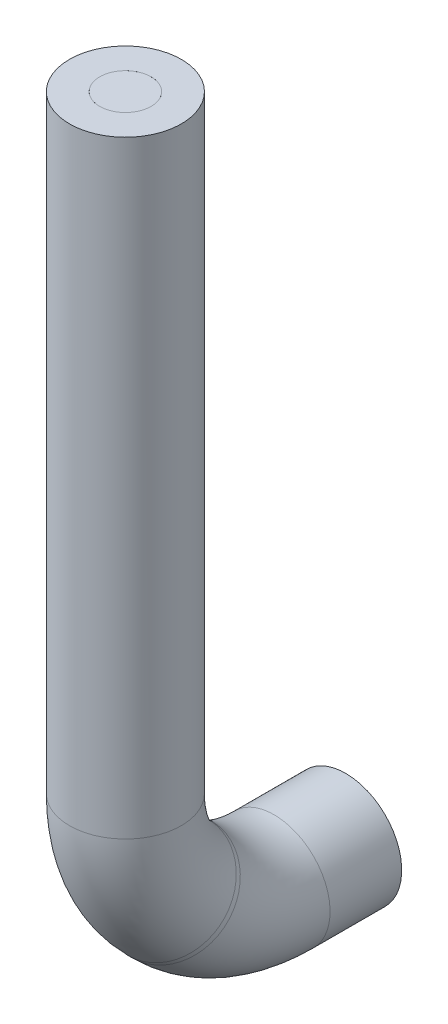
ISO-10303-21;
HEADER;
FILE_DESCRIPTION(('STEP AP214'),'2;1');
FILE_NAME('part.step','',(''),(''),'','','');
FILE_SCHEMA(('AUTOMOTIVE_DESIGN { 1 0 10303 214 1 1 1 1 }'));
ENDSEC;
DATA;
#1=APPLICATION_CONTEXT('core data for automotive mechanical design processes');
#2=APPLICATION_PROTOCOL_DEFINITION('international standard','automotive_design',2000,#1);
#3=PRODUCT_CONTEXT('',#1,'mechanical');
#4=PRODUCT('Part','Part','',(#3));
#5=PRODUCT_RELATED_PRODUCT_CATEGORY('part','',(#4));
#6=PRODUCT_DEFINITION_FORMATION('','',#4);
#7=PRODUCT_DEFINITION_CONTEXT('part definition',#1,'design');
#8=PRODUCT_DEFINITION('design','',#6,#7);
#9=PRODUCT_DEFINITION_SHAPE('','',#8);
#10=(LENGTH_UNIT() NAMED_UNIT(*) SI_UNIT(.MILLI.,.METRE.));
#11=(NAMED_UNIT(*) PLANE_ANGLE_UNIT() SI_UNIT($,.RADIAN.));
#12=(NAMED_UNIT(*) SI_UNIT($,.STERADIAN.) SOLID_ANGLE_UNIT());
#13=UNCERTAINTY_MEASURE_WITH_UNIT(LENGTH_MEASURE(1.E-05),#10,'distance_accuracy_value','');
#14=(GEOMETRIC_REPRESENTATION_CONTEXT(3) GLOBAL_UNCERTAINTY_ASSIGNED_CONTEXT((#13)) GLOBAL_UNIT_ASSIGNED_CONTEXT((#10,
#11,#12)) REPRESENTATION_CONTEXT('',''));
#15=CARTESIAN_POINT('',(0.,0.,0.));
#16=DIRECTION('',(0.,0.,1.));
#17=DIRECTION('',(1.,0.,0.));
#18=AXIS2_PLACEMENT_3D('',#15,#16,#17);
#19=CARTESIAN_POINT('',(0.,11.49999984,0.));
#20=DIRECTION('',(0.,-1.,0.));
#21=DIRECTION('',(0.,0.,-1.));
#22=AXIS2_PLACEMENT_3D('',#19,#20,#21);
#23=CYLINDRICAL_SURFACE('',#22,0.85);
#24=CARTESIAN_POINT('',(0.,2.26126984,0.));
#25=DIRECTION('',(0.,-1.,0.));
#26=DIRECTION('',(-1.,0.,0.));
#27=AXIS2_PLACEMENT_3D('',#24,#25,#26);
#28=CIRCLE('',#27,0.85);
#29=CARTESIAN_POINT('',(0.,2.26126984,0.850000000000001));
#30=VERTEX_POINT('',#29);
#31=EDGE_CURVE('E67',#30,#30,#28,.T.);
#32=ORIENTED_EDGE('',*,*,#31,.F.);
#33=EDGE_LOOP('',(#32));
#34=FACE_BOUND('',#33,.T.);
#35=CARTESIAN_POINT('',(0.,11.49999984,0.));
#36=DIRECTION('',(0.,-1.,0.));
#37=DIRECTION('',(-1.,0.,0.));
#38=AXIS2_PLACEMENT_3D('',#35,#36,#37);
#39=CIRCLE('',#38,0.85);
#40=CARTESIAN_POINT('',(-0.85,11.49999984,0.));
#41=VERTEX_POINT('',#40);
#42=EDGE_CURVE('E64',#41,#41,#39,.T.);
#43=ORIENTED_EDGE('',*,*,#42,.T.);
#44=EDGE_LOOP('',(#43));
#45=FACE_BOUND('',#44,.T.);
#46=ADVANCED_FACE('F43',(#34,#45),#23,.T.);
#47=CARTESIAN_POINT('',(0.,2.26126984,-2.2));
#48=DIRECTION('',(1.,0.,0.));
#49=DIRECTION('',(0.,0.,-1.));
#50=AXIS2_PLACEMENT_3D('',#47,#48,#49);
#51=TOROIDAL_SURFACE('',#50,2.2,0.85);
#52=CARTESIAN_POINT('',(0.,0.705634921389591,-0.644365081389602));
#53=DIRECTION('',(0.,-0.707106781186544,-0.707106781186551));
#54=DIRECTION('',(-1.,0.,0.));
#55=AXIS2_PLACEMENT_3D('',#52,#53,#54);
#56=CIRCLE('',#55,0.85);
#57=CARTESIAN_POINT('',(0.,0.104594157381023,-0.0433243173810398));
#58=VERTEX_POINT('',#57);
#59=EDGE_CURVE('E70',#58,#58,#56,.T.);
#60=CARTESIAN_POINT('',(0.,2.26126984,-2.2));
#61=DIRECTION('',(1.,0.,0.));
#62=DIRECTION('',(0.,0.,-1.));
#63=AXIS2_PLACEMENT_3D('',#60,#61,#62);
#64=CIRCLE('',#63,3.05);
#65=EDGE_CURVE('',#30,#58,#64,.T.);
#66=ORIENTED_EDGE('',*,*,#31,.T.);
#67=ORIENTED_EDGE('',*,*,#59,.F.);
#68=ORIENTED_EDGE('',*,*,#65,.T.);
#69=ORIENTED_EDGE('',*,*,#65,.F.);
#70=EDGE_LOOP('',(#66,#68,#67,#69));
#71=FACE_BOUND('',#70,.T.);
#72=ADVANCED_FACE('F89',(#71),#51,.T.);
#73=CARTESIAN_POINT('',(0.,0.705634921389591,-0.644365081389603));
#74=DIRECTION('',(0.,-0.707106781186549,-0.707106781186546));
#75=DIRECTION('',(0.,0.707106781186546,-0.707106781186549));
#76=AXIS2_PLACEMENT_3D('',#73,#74,#75);
#77=CYLINDRICAL_SURFACE('',#76,0.85);
#78=CARTESIAN_POINT('',(0.,0.644365081389586,-0.705634921389607));
#79=DIRECTION('',(0.,-0.707106781186549,-0.707106781186546));
#80=DIRECTION('',(-1.,0.,0.));
#81=AXIS2_PLACEMENT_3D('',#78,#79,#80);
#82=CIRCLE('',#81,0.85);
#83=CARTESIAN_POINT('',(0.,0.0433243173810181,-0.104594157381045));
#84=VERTEX_POINT('',#83);
#85=EDGE_CURVE('E72',#84,#84,#82,.T.);
#86=ORIENTED_EDGE('',*,*,#85,.F.);
#87=EDGE_LOOP('',(#86));
#88=FACE_BOUND('',#87,.T.);
#89=ORIENTED_EDGE('',*,*,#59,.T.);
#90=EDGE_LOOP('',(#89));
#91=FACE_BOUND('',#90,.T.);
#92=ADVANCED_FACE('F82',(#88,#91),#77,.T.);
#93=CARTESIAN_POINT('',(0.,2.2,-2.26126984));
#94=DIRECTION('',(1.,0.,0.));
#95=DIRECTION('',(0.,0.,-1.));
#96=AXIS2_PLACEMENT_3D('',#93,#94,#95);
#97=TOROIDAL_SURFACE('',#96,2.2,0.85);
#98=CARTESIAN_POINT('',(0.,0.,-2.26126984));
#99=DIRECTION('',(0.,0.,-1.));
#100=DIRECTION('',(-1.,0.,0.));
#101=AXIS2_PLACEMENT_3D('',#98,#99,#100);
#102=CIRCLE('',#101,0.85);
#103=CARTESIAN_POINT('',(0.,-0.850000000000001,-2.26126984));
#104=VERTEX_POINT('',#103);
#105=EDGE_CURVE('E47',#104,#104,#102,.T.);
#106=CARTESIAN_POINT('',(0.,2.2,-2.26126984));
#107=DIRECTION('',(1.,0.,0.));
#108=DIRECTION('',(0.,0.,-1.));
#109=AXIS2_PLACEMENT_3D('',#106,#107,#108);
#110=CIRCLE('',#109,3.05);
#111=EDGE_CURVE('',#84,#104,#110,.T.);
#112=ORIENTED_EDGE('',*,*,#85,.T.);
#113=ORIENTED_EDGE('',*,*,#105,.F.);
#114=ORIENTED_EDGE('',*,*,#111,.T.);
#115=ORIENTED_EDGE('',*,*,#111,.F.);
#116=EDGE_LOOP('',(#112,#114,#113,#115));
#117=FACE_BOUND('',#116,.T.);
#118=ADVANCED_FACE('F80',(#117),#97,.T.);
#119=CARTESIAN_POINT('',(0.,0.,-2.26126984));
#120=DIRECTION('',(0.,0.,-1.));
#121=DIRECTION('',(0.,1.,0.));
#122=AXIS2_PLACEMENT_3D('',#119,#120,#121);
#123=CYLINDRICAL_SURFACE('',#122,0.85);
#124=CARTESIAN_POINT('',(0.,0.,-3.35));
#125=DIRECTION('',(0.,0.,-1.));
#126=DIRECTION('',(-1.,0.,0.));
#127=AXIS2_PLACEMENT_3D('',#124,#125,#126);
#128=CIRCLE('',#127,0.85);
#129=CARTESIAN_POINT('',(-0.85,0.,-3.35));
#130=VERTEX_POINT('',#129);
#131=EDGE_CURVE('E60',#130,#130,#128,.T.);
#132=ORIENTED_EDGE('',*,*,#131,.F.);
#133=EDGE_LOOP('',(#132));
#134=FACE_BOUND('',#133,.T.);
#135=ORIENTED_EDGE('',*,*,#105,.T.);
#136=EDGE_LOOP('',(#135));
#137=FACE_BOUND('',#136,.T.);
#138=ADVANCED_FACE('F45',(#134,#137),#123,.T.);
#139=CARTESIAN_POINT('',(0.,11.49999984,0.));
#140=DIRECTION('',(0.,-1.,0.));
#141=DIRECTION('',(-1.,0.,0.));
#142=AXIS2_PLACEMENT_3D('',#139,#140,#141);
#143=PLANE('',#142);
#144=CARTESIAN_POINT('',(0.,11.49999984,0.));
#145=DIRECTION('',(0.,-1.,0.));
#146=DIRECTION('',(-1.,0.,0.));
#147=AXIS2_PLACEMENT_3D('',#144,#145,#146);
#148=CIRCLE('',#147,0.39);
#149=CARTESIAN_POINT('',(-0.39,11.49999984,0.));
#150=VERTEX_POINT('',#149);
#151=EDGE_CURVE('E63',#150,#150,#148,.F.);
#152=ORIENTED_EDGE('',*,*,#151,.F.);
#153=EDGE_LOOP('',(#152));
#154=FACE_BOUND('',#153,.T.);
#155=ORIENTED_EDGE('',*,*,#42,.F.);
#156=EDGE_LOOP('',(#155));
#157=FACE_BOUND('',#156,.T.);
#158=ADVANCED_FACE('F87',(#154,#157),#143,.F.);
#159=CARTESIAN_POINT('',(0.,0.,-3.35));
#160=DIRECTION('',(0.,0.,-1.));
#161=DIRECTION('',(-1.,0.,0.));
#162=AXIS2_PLACEMENT_3D('',#159,#160,#161);
#163=PLANE('',#162);
#164=CARTESIAN_POINT('',(0.,0.,-3.35));
#165=DIRECTION('',(0.,0.,-1.));
#166=DIRECTION('',(-1.,0.,0.));
#167=AXIS2_PLACEMENT_3D('',#164,#165,#166);
#168=CIRCLE('',#167,0.39);
#169=CARTESIAN_POINT('',(-0.39,0.,-3.35));
#170=VERTEX_POINT('',#169);
#171=EDGE_CURVE('E11',#170,#170,#168,.F.);
#172=ORIENTED_EDGE('',*,*,#171,.T.);
#173=EDGE_LOOP('',(#172));
#174=FACE_BOUND('',#173,.T.);
#175=ORIENTED_EDGE('',*,*,#131,.T.);
#176=EDGE_LOOP('',(#175));
#177=FACE_BOUND('',#176,.T.);
#178=ADVANCED_FACE('F106',(#174,#177),#163,.T.);
#179=CARTESIAN_POINT('',(0.,11.49999984,0.));
#180=DIRECTION('',(0.,-1.,0.));
#181=DIRECTION('',(0.,0.,-1.));
#182=AXIS2_PLACEMENT_3D('',#179,#180,#181);
#183=CYLINDRICAL_SURFACE('',#182,0.39);
#184=CARTESIAN_POINT('',(0.,2.26126984,0.));
#185=DIRECTION('',(0.,-1.,0.));
#186=DIRECTION('',(-1.,0.,0.));
#187=AXIS2_PLACEMENT_3D('',#184,#185,#186);
#188=CIRCLE('',#187,0.39);
#189=CARTESIAN_POINT('',(0.,2.26126984,0.390000000000001));
#190=VERTEX_POINT('',#189);
#191=EDGE_CURVE('E202',#190,#190,#188,.F.);
#192=ORIENTED_EDGE('',*,*,#191,.F.);
#193=EDGE_LOOP('',(#192));
#194=FACE_BOUND('',#193,.T.);
#195=ORIENTED_EDGE('',*,*,#151,.T.);
#196=EDGE_LOOP('',(#195));
#197=FACE_BOUND('',#196,.T.);
#198=ADVANCED_FACE('F109',(#194,#197),#183,.F.);
#199=CARTESIAN_POINT('',(0.,2.26126984,-2.2));
#200=DIRECTION('',(1.,0.,0.));
#201=DIRECTION('',(0.,0.,-1.));
#202=AXIS2_PLACEMENT_3D('',#199,#200,#201);
#203=TOROIDAL_SURFACE('',#202,2.2,0.39);
#204=CARTESIAN_POINT('',(0.,0.705634921389591,-0.644365081389602));
#205=DIRECTION('',(0.,-0.707106781186544,-0.707106781186551));
#206=DIRECTION('',(-1.,0.,0.));
#207=AXIS2_PLACEMENT_3D('',#204,#205,#206);
#208=CIRCLE('',#207,0.39);
#209=CARTESIAN_POINT('',(0.,0.429863276726837,-0.36859343672685));
#210=VERTEX_POINT('',#209);
#211=EDGE_CURVE('E201',#210,#210,#208,.F.);
#212=CARTESIAN_POINT('',(0.,2.26126984,-2.2));
#213=DIRECTION('',(1.,0.,0.));
#214=DIRECTION('',(0.,0.,-1.));
#215=AXIS2_PLACEMENT_3D('',#212,#213,#214);
#216=CIRCLE('',#215,2.59);
#217=EDGE_CURVE('',#190,#210,#216,.T.);
#218=ORIENTED_EDGE('',*,*,#191,.T.);
#219=ORIENTED_EDGE('',*,*,#211,.F.);
#220=ORIENTED_EDGE('',*,*,#217,.T.);
#221=ORIENTED_EDGE('',*,*,#217,.F.);
#222=EDGE_LOOP('',(#218,#220,#219,#221));
#223=FACE_BOUND('',#222,.T.);
#224=ADVANCED_FACE('F164',(#223),#203,.F.);
#225=CARTESIAN_POINT('',(0.,0.705634921389591,-0.644365081389603));
#226=DIRECTION('',(0.,-0.707106781186549,-0.707106781186546));
#227=DIRECTION('',(0.,0.707106781186546,-0.707106781186549));
#228=AXIS2_PLACEMENT_3D('',#225,#226,#227);
#229=CYLINDRICAL_SURFACE('',#228,0.39);
#230=CARTESIAN_POINT('',(0.,0.644365081389586,-0.705634921389607));
#231=DIRECTION('',(0.,-0.707106781186549,-0.707106781186546));
#232=DIRECTION('',(-1.,0.,0.));
#233=AXIS2_PLACEMENT_3D('',#230,#231,#232);
#234=CIRCLE('',#233,0.39);
#235=CARTESIAN_POINT('',(0.,0.368593436726832,-0.429863276726855));
#236=VERTEX_POINT('',#235);
#237=EDGE_CURVE('E56',#236,#236,#234,.F.);
#238=ORIENTED_EDGE('',*,*,#237,.F.);
#239=EDGE_LOOP('',(#238));
#240=FACE_BOUND('',#239,.T.);
#241=ORIENTED_EDGE('',*,*,#211,.T.);
#242=EDGE_LOOP('',(#241));
#243=FACE_BOUND('',#242,.T.);
#244=ADVANCED_FACE('F100',(#240,#243),#229,.F.);
#245=CARTESIAN_POINT('',(0.,2.2,-2.26126984));
#246=DIRECTION('',(1.,0.,0.));
#247=DIRECTION('',(0.,0.,-1.));
#248=AXIS2_PLACEMENT_3D('',#245,#246,#247);
#249=TOROIDAL_SURFACE('',#248,2.2,0.39);
#250=CARTESIAN_POINT('',(0.,0.,-2.26126984));
#251=DIRECTION('',(0.,0.,-1.));
#252=DIRECTION('',(-1.,0.,0.));
#253=AXIS2_PLACEMENT_3D('',#250,#251,#252);
#254=CIRCLE('',#253,0.39);
#255=CARTESIAN_POINT('',(0.,-0.390000000000001,-2.26126984));
#256=VERTEX_POINT('',#255);
#257=EDGE_CURVE('E51',#256,#256,#254,.F.);
#258=CARTESIAN_POINT('',(0.,2.2,-2.26126984));
#259=DIRECTION('',(1.,0.,0.));
#260=DIRECTION('',(0.,0.,-1.));
#261=AXIS2_PLACEMENT_3D('',#258,#259,#260);
#262=CIRCLE('',#261,2.59);
#263=EDGE_CURVE('',#236,#256,#262,.T.);
#264=ORIENTED_EDGE('',*,*,#237,.T.);
#265=ORIENTED_EDGE('',*,*,#257,.F.);
#266=ORIENTED_EDGE('',*,*,#263,.T.);
#267=ORIENTED_EDGE('',*,*,#263,.F.);
#268=EDGE_LOOP('',(#264,#266,#265,#267));
#269=FACE_BOUND('',#268,.T.);
#270=ADVANCED_FACE('F94',(#269),#249,.F.);
#271=CARTESIAN_POINT('',(0.,0.,-2.26126984));
#272=DIRECTION('',(0.,0.,-1.));
#273=DIRECTION('',(0.,1.,0.));
#274=AXIS2_PLACEMENT_3D('',#271,#272,#273);
#275=CYLINDRICAL_SURFACE('',#274,0.39);
#276=ORIENTED_EDGE('',*,*,#171,.F.);
#277=EDGE_LOOP('',(#276));
#278=FACE_BOUND('',#277,.T.);
#279=ORIENTED_EDGE('',*,*,#257,.T.);
#280=EDGE_LOOP('',(#279));
#281=FACE_BOUND('',#280,.T.);
#282=ADVANCED_FACE('F92',(#278,#281),#275,.F.);
#283=CLOSED_SHELL('',(#46,#72,#92,#118,#138,#158,#178,#198,#224,#244,#270,#282));
#284=MANIFOLD_SOLID_BREP('B2',#283);
#285=CARTESIAN_POINT('',(0.,11.49999984,0.));
#286=DIRECTION('',(0.,1.,0.));
#287=DIRECTION('',(1.,0.,0.));
#288=AXIS2_PLACEMENT_3D('',#285,#286,#287);
#289=PLANE('',#288);
#290=CARTESIAN_POINT('',(0.,11.49999984,0.));
#291=DIRECTION('',(0.,1.,0.));
#292=DIRECTION('',(1.,0.,0.));
#293=AXIS2_PLACEMENT_3D('',#290,#291,#292);
#294=CIRCLE('',#293,0.39);
#295=CARTESIAN_POINT('',(0.39,11.49999984,0.));
#296=VERTEX_POINT('',#295);
#297=EDGE_CURVE('E247',#296,#296,#294,.T.);
#298=ORIENTED_EDGE('',*,*,#297,.T.);
#299=EDGE_LOOP('',(#298));
#300=FACE_BOUND('',#299,.T.);
#301=ADVANCED_FACE('F225',(#300),#289,.T.);
#302=CARTESIAN_POINT('',(0.,0.,-3.35));
#303=DIRECTION('',(0.,0.,1.));
#304=DIRECTION('',(1.,0.,0.));
#305=AXIS2_PLACEMENT_3D('',#302,#303,#304);
#306=PLANE('',#305);
#307=CARTESIAN_POINT('',(0.,0.,-3.35));
#308=DIRECTION('',(0.,0.,1.));
#309=DIRECTION('',(1.,0.,0.));
#310=AXIS2_PLACEMENT_3D('',#307,#308,#309);
#311=CIRCLE('',#310,0.39);
#312=CARTESIAN_POINT('',(0.39,0.,-3.35));
#313=VERTEX_POINT('',#312);
#314=EDGE_CURVE('E42',#313,#313,#311,.T.);
#315=ORIENTED_EDGE('',*,*,#314,.F.);
#316=EDGE_LOOP('',(#315));
#317=FACE_BOUND('',#316,.T.);
#318=ADVANCED_FACE('F255',(#317),#306,.F.);
#319=CARTESIAN_POINT('',(0.,11.49999984,0.));
#320=DIRECTION('',(0.,-1.,0.));
#321=DIRECTION('',(0.,0.,-1.));
#322=AXIS2_PLACEMENT_3D('',#319,#320,#321);
#323=CYLINDRICAL_SURFACE('',#322,0.39);
#324=CARTESIAN_POINT('',(0.,2.26126984,0.));
#325=DIRECTION('',(0.,1.,0.));
#326=DIRECTION('',(1.,0.,0.));
#327=AXIS2_PLACEMENT_3D('',#324,#325,#326);
#328=CIRCLE('',#327,0.39);
#329=CARTESIAN_POINT('',(0.,2.26126984,0.390000000000001));
#330=VERTEX_POINT('',#329);
#331=EDGE_CURVE('E244',#330,#330,#328,.T.);
#332=ORIENTED_EDGE('',*,*,#331,.T.);
#333=EDGE_LOOP('',(#332));
#334=FACE_BOUND('',#333,.T.);
#335=ORIENTED_EDGE('',*,*,#297,.F.);
#336=EDGE_LOOP('',(#335));
#337=FACE_BOUND('',#336,.T.);
#338=ADVANCED_FACE('F252',(#334,#337),#323,.T.);
#339=CARTESIAN_POINT('',(0.,2.26126984,-2.2));
#340=DIRECTION('',(1.,0.,0.));
#341=DIRECTION('',(0.,0.,-1.));
#342=AXIS2_PLACEMENT_3D('',#339,#340,#341);
#343=TOROIDAL_SURFACE('',#342,2.2,0.39);
#344=CARTESIAN_POINT('',(0.,0.705634921389591,-0.644365081389602));
#345=DIRECTION('',(0.,0.707106781186544,0.707106781186551));
#346=DIRECTION('',(1.,0.,0.));
#347=AXIS2_PLACEMENT_3D('',#344,#345,#346);
#348=CIRCLE('',#347,0.39);
#349=CARTESIAN_POINT('',(0.,0.429863276726837,-0.36859343672685));
#350=VERTEX_POINT('',#349);
#351=EDGE_CURVE('E239',#350,#350,#348,.T.);
#352=CARTESIAN_POINT('',(0.,2.26126984,-2.2));
#353=DIRECTION('',(1.,0.,0.));
#354=DIRECTION('',(0.,0.,-1.));
#355=AXIS2_PLACEMENT_3D('',#352,#353,#354);
#356=CIRCLE('',#355,2.59);
#357=EDGE_CURVE('',#330,#350,#356,.T.);
#358=ORIENTED_EDGE('',*,*,#331,.F.);
#359=ORIENTED_EDGE('',*,*,#351,.T.);
#360=ORIENTED_EDGE('',*,*,#357,.T.);
#361=ORIENTED_EDGE('',*,*,#357,.F.);
#362=EDGE_LOOP('',(#358,#360,#359,#361));
#363=FACE_BOUND('',#362,.T.);
#364=ADVANCED_FACE('F254',(#363),#343,.T.);
#365=CARTESIAN_POINT('',(0.,0.705634921389591,-0.644365081389603));
#366=DIRECTION('',(0.,-0.707106781186549,-0.707106781186546));
#367=DIRECTION('',(0.,0.707106781186546,-0.707106781186549));
#368=AXIS2_PLACEMENT_3D('',#365,#366,#367);
#369=CYLINDRICAL_SURFACE('',#368,0.39);
#370=CARTESIAN_POINT('',(0.,0.644365081389586,-0.705634921389607));
#371=DIRECTION('',(0.,0.707106781186549,0.707106781186546));
#372=DIRECTION('',(1.,0.,0.));
#373=AXIS2_PLACEMENT_3D('',#370,#371,#372);
#374=CIRCLE('',#373,0.39);
#375=CARTESIAN_POINT('',(0.,0.368593436726832,-0.429863276726855));
#376=VERTEX_POINT('',#375);
#377=EDGE_CURVE('E235',#376,#376,#374,.T.);
#378=ORIENTED_EDGE('',*,*,#377,.T.);
#379=EDGE_LOOP('',(#378));
#380=FACE_BOUND('',#379,.T.);
#381=ORIENTED_EDGE('',*,*,#351,.F.);
#382=EDGE_LOOP('',(#381));
#383=FACE_BOUND('',#382,.T.);
#384=ADVANCED_FACE('F262',(#380,#383),#369,.T.);
#385=CARTESIAN_POINT('',(0.,2.2,-2.26126984));
#386=DIRECTION('',(1.,0.,0.));
#387=DIRECTION('',(0.,0.,-1.));
#388=AXIS2_PLACEMENT_3D('',#385,#386,#387);
#389=TOROIDAL_SURFACE('',#388,2.2,0.39);
#390=CARTESIAN_POINT('',(0.,0.,-2.26126984));
#391=DIRECTION('',(0.,0.,1.));
#392=DIRECTION('',(1.,0.,0.));
#393=AXIS2_PLACEMENT_3D('',#390,#391,#392);
#394=CIRCLE('',#393,0.39);
#395=CARTESIAN_POINT('',(0.,-0.390000000000001,-2.26126984));
#396=VERTEX_POINT('',#395);
#397=EDGE_CURVE('E231',#396,#396,#394,.T.);
#398=CARTESIAN_POINT('',(0.,2.2,-2.26126984));
#399=DIRECTION('',(1.,0.,0.));
#400=DIRECTION('',(0.,0.,-1.));
#401=AXIS2_PLACEMENT_3D('',#398,#399,#400);
#402=CIRCLE('',#401,2.59);
#403=EDGE_CURVE('',#376,#396,#402,.T.);
#404=ORIENTED_EDGE('',*,*,#377,.F.);
#405=ORIENTED_EDGE('',*,*,#397,.T.);
#406=ORIENTED_EDGE('',*,*,#403,.T.);
#407=ORIENTED_EDGE('',*,*,#403,.F.);
#408=EDGE_LOOP('',(#404,#406,#405,#407));
#409=FACE_BOUND('',#408,.T.);
#410=ADVANCED_FACE('F268',(#409),#389,.T.);
#411=CARTESIAN_POINT('',(0.,0.,-2.26126984));
#412=DIRECTION('',(0.,0.,-1.));
#413=DIRECTION('',(0.,1.,0.));
#414=AXIS2_PLACEMENT_3D('',#411,#412,#413);
#415=CYLINDRICAL_SURFACE('',#414,0.39);
#416=ORIENTED_EDGE('',*,*,#314,.T.);
#417=EDGE_LOOP('',(#416));
#418=FACE_BOUND('',#417,.T.);
#419=ORIENTED_EDGE('',*,*,#397,.F.);
#420=EDGE_LOOP('',(#419));
#421=FACE_BOUND('',#420,.T.);
#422=ADVANCED_FACE('F266',(#418,#421),#415,.T.);
#423=CLOSED_SHELL('',(#301,#318,#338,#364,#384,#410,#422));
#424=MANIFOLD_SOLID_BREP('B6',#423);
#425=ADVANCED_BREP_SHAPE_REPRESENTATION('',(#18,#284,#424),#14);
#426=SHAPE_DEFINITION_REPRESENTATION(#9,#425);
ENDSEC;
END-ISO-10303-21;
